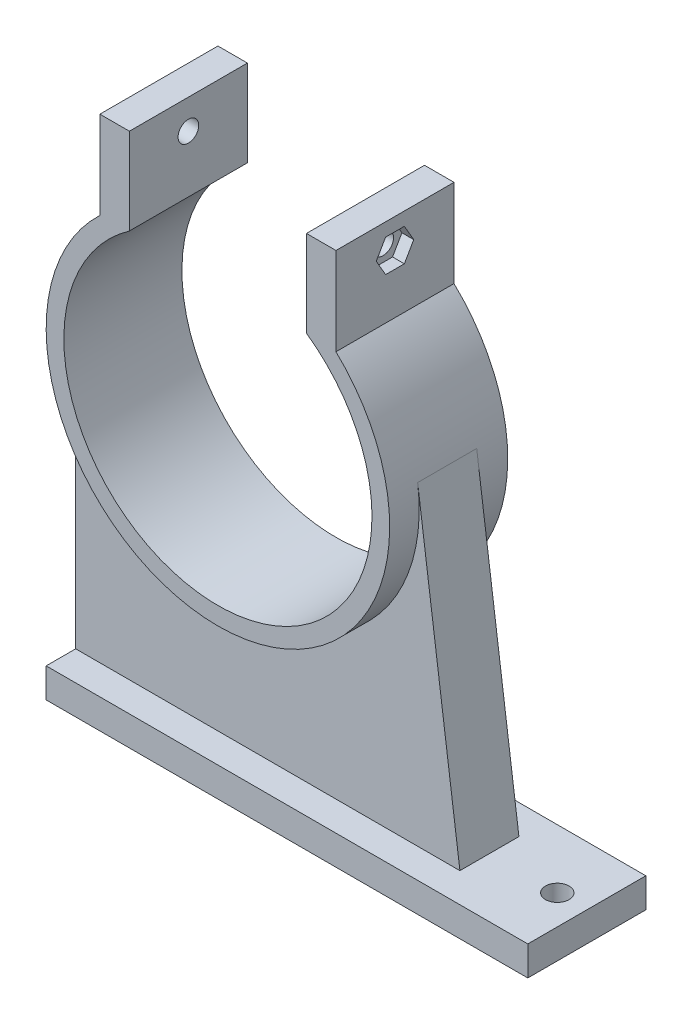
ISO-10303-21;
HEADER;
FILE_DESCRIPTION(('STEP AP214'),'2;1');
FILE_NAME('part.step','',(''),(''),'','','');
FILE_SCHEMA(('AUTOMOTIVE_DESIGN { 1 0 10303 214 1 1 1 1 }'));
ENDSEC;
DATA;
#1=APPLICATION_CONTEXT('core data for automotive mechanical design processes');
#2=APPLICATION_PROTOCOL_DEFINITION('international standard','automotive_design',2000,#1);
#3=PRODUCT_CONTEXT('',#1,'mechanical');
#4=PRODUCT('Part','Part','',(#3));
#5=PRODUCT_RELATED_PRODUCT_CATEGORY('part','',(#4));
#6=PRODUCT_DEFINITION_FORMATION('','',#4);
#7=PRODUCT_DEFINITION_CONTEXT('part definition',#1,'design');
#8=PRODUCT_DEFINITION('design','',#6,#7);
#9=PRODUCT_DEFINITION_SHAPE('','',#8);
#10=(LENGTH_UNIT() NAMED_UNIT(*) SI_UNIT(.MILLI.,.METRE.));
#11=(NAMED_UNIT(*) PLANE_ANGLE_UNIT() SI_UNIT($,.RADIAN.));
#12=(NAMED_UNIT(*) SI_UNIT($,.STERADIAN.) SOLID_ANGLE_UNIT());
#13=UNCERTAINTY_MEASURE_WITH_UNIT(LENGTH_MEASURE(1.E-05),#10,'distance_accuracy_value','');
#14=(GEOMETRIC_REPRESENTATION_CONTEXT(3) GLOBAL_UNCERTAINTY_ASSIGNED_CONTEXT((#13)) GLOBAL_UNIT_ASSIGNED_CONTEXT((#10,
#11,#12)) REPRESENTATION_CONTEXT('',''));
#15=CARTESIAN_POINT('',(0.,0.,0.));
#16=DIRECTION('',(0.,0.,1.));
#17=DIRECTION('',(1.,0.,0.));
#18=AXIS2_PLACEMENT_3D('',#15,#16,#17);
#19=CARTESIAN_POINT('',(0.,0.,20.));
#20=DIRECTION('',(0.,0.,-1.));
#21=DIRECTION('',(-1.,0.,0.));
#22=AXIS2_PLACEMENT_3D('',#19,#20,#21);
#23=CYLINDRICAL_SURFACE('',#22,29.1);
#24=CARTESIAN_POINT('',(0.,0.,0.));
#25=DIRECTION('',(0.,0.,1.));
#26=DIRECTION('',(1.,0.,0.));
#27=AXIS2_PLACEMENT_3D('',#24,#25,#26);
#28=CIRCLE('',#27,29.1);
#29=CARTESIAN_POINT('',(-20.,21.1378806884702,0.));
#30=VERTEX_POINT('',#29);
#31=CARTESIAN_POINT('',(20.,21.1378806884702,0.));
#32=VERTEX_POINT('',#31);
#33=EDGE_CURVE('E432',#30,#32,#28,.T.);
#34=ORIENTED_EDGE('',*,*,#33,.T.);
#35=DIRECTION('',(0.,0.,-1.));
#36=VECTOR('',#35,1.);
#37=CARTESIAN_POINT('',(20.,21.1378806884702,20.));
#38=LINE('',#37,#36);
#39=CARTESIAN_POINT('',(20.,21.1378806884702,20.));
#40=VERTEX_POINT('',#39);
#41=EDGE_CURVE('E50',#32,#40,#38,.F.);
#42=ORIENTED_EDGE('',*,*,#41,.T.);
#43=CARTESIAN_POINT('',(0.,0.,20.));
#44=DIRECTION('',(0.,0.,1.));
#45=DIRECTION('',(1.,0.,0.));
#46=AXIS2_PLACEMENT_3D('',#43,#44,#45);
#47=CIRCLE('',#46,29.1);
#48=CARTESIAN_POINT('',(-20.,21.1378806884702,20.));
#49=VERTEX_POINT('',#48);
#50=EDGE_CURVE('E435',#49,#40,#47,.T.);
#51=ORIENTED_EDGE('',*,*,#50,.F.);
#52=DIRECTION('',(0.,0.,-1.));
#53=VECTOR('',#52,1.);
#54=CARTESIAN_POINT('',(-20.,21.1378806884702,20.));
#55=LINE('',#54,#53);
#56=EDGE_CURVE('E439',#49,#30,#55,.T.);
#57=ORIENTED_EDGE('',*,*,#56,.T.);
#58=EDGE_LOOP('',(#34,#42,#51,#57));
#59=FACE_BOUND('',#58,.T.);
#60=CARTESIAN_POINT('',(0.,0.,15.));
#61=DIRECTION('',(0.,0.,-1.));
#62=DIRECTION('',(-1.,0.,0.));
#63=AXIS2_PLACEMENT_3D('',#60,#61,#62);
#64=CIRCLE('',#63,29.1);
#65=CARTESIAN_POINT('',(28.8417154559818,3.86852033162312,15.));
#66=VERTEX_POINT('',#65);
#67=CARTESIAN_POINT('',(-29.1,0.,15.));
#68=VERTEX_POINT('',#67);
#69=EDGE_CURVE('E282',#66,#68,#64,.T.);
#70=ORIENTED_EDGE('',*,*,#69,.F.);
#71=DIRECTION('',(0.,0.,-1.));
#72=VECTOR('',#71,1.);
#73=CARTESIAN_POINT('',(28.8417154559818,3.86852033162312,15.));
#74=LINE('',#73,#72);
#75=CARTESIAN_POINT('',(28.8417154559818,3.86852033162312,5.));
#76=VERTEX_POINT('',#75);
#77=EDGE_CURVE('E265',#66,#76,#74,.T.);
#78=ORIENTED_EDGE('',*,*,#77,.T.);
#79=CARTESIAN_POINT('',(0.,0.,5.));
#80=DIRECTION('',(0.,0.,-1.));
#81=DIRECTION('',(-1.,0.,0.));
#82=AXIS2_PLACEMENT_3D('',#79,#80,#81);
#83=CIRCLE('',#82,29.1);
#84=CARTESIAN_POINT('',(-29.1,0.,5.));
#85=VERTEX_POINT('',#84);
#86=EDGE_CURVE('E269',#76,#85,#83,.T.);
#87=ORIENTED_EDGE('',*,*,#86,.T.);
#88=DIRECTION('',(0.,0.,-1.));
#89=VECTOR('',#88,1.);
#90=CARTESIAN_POINT('',(-29.1,0.,15.));
#91=LINE('',#90,#89);
#92=EDGE_CURVE('E270',#68,#85,#91,.T.);
#93=ORIENTED_EDGE('',*,*,#92,.F.);
#94=EDGE_LOOP('',(#70,#78,#87,#93));
#95=FACE_BOUND('',#94,.T.);
#96=ADVANCED_FACE('F41',(#59,#95),#23,.T.);
#97=CARTESIAN_POINT('',(29.1,31.,10.));
#98=DIRECTION('',(-1.,0.,0.));
#99=DIRECTION('',(0.,0.,1.));
#100=AXIS2_PLACEMENT_3D('',#97,#98,#99);
#101=CYLINDRICAL_SURFACE('',#100,1.75);
#102=CARTESIAN_POINT('',(15.,31.,10.));
#103=DIRECTION('',(-1.,0.,0.));
#104=DIRECTION('',(0.,0.,1.));
#105=AXIS2_PLACEMENT_3D('',#102,#103,#104);
#106=CIRCLE('',#105,1.75);
#107=CARTESIAN_POINT('',(15.,31.,11.75));
#108=VERTEX_POINT('',#107);
#109=EDGE_CURVE('E366',#108,#108,#106,.T.);
#110=ORIENTED_EDGE('',*,*,#109,.T.);
#111=EDGE_LOOP('',(#110));
#112=FACE_BOUND('',#111,.T.);
#113=CARTESIAN_POINT('',(18.,31.,10.));
#114=DIRECTION('',(1.,0.,0.));
#115=DIRECTION('',(0.,0.,-1.));
#116=AXIS2_PLACEMENT_3D('',#113,#114,#115);
#117=CIRCLE('',#116,1.75);
#118=CARTESIAN_POINT('',(18.,31.,8.25));
#119=VERTEX_POINT('',#118);
#120=EDGE_CURVE('E44',#119,#119,#117,.F.);
#121=ORIENTED_EDGE('',*,*,#120,.F.);
#122=EDGE_LOOP('',(#121));
#123=FACE_BOUND('',#122,.T.);
#124=ADVANCED_FACE('F458',(#112,#123),#101,.F.);
#125=CARTESIAN_POINT('',(-15.,31.,10.));
#126=DIRECTION('',(1.,0.,0.));
#127=DIRECTION('',(0.,0.,-1.));
#128=AXIS2_PLACEMENT_3D('',#125,#126,#127);
#129=CIRCLE('',#128,1.75);
#130=CARTESIAN_POINT('',(-15.,31.,8.25));
#131=VERTEX_POINT('',#130);
#132=EDGE_CURVE('E361',#131,#131,#129,.T.);
#133=ORIENTED_EDGE('',*,*,#132,.T.);
#134=EDGE_LOOP('',(#133));
#135=FACE_BOUND('',#134,.T.);
#136=CARTESIAN_POINT('',(-18.,31.,10.));
#137=DIRECTION('',(-1.,0.,0.));
#138=DIRECTION('',(0.,0.,1.));
#139=AXIS2_PLACEMENT_3D('',#136,#137,#138);
#140=CIRCLE('',#139,1.75);
#141=CARTESIAN_POINT('',(-18.,31.,11.75));
#142=VERTEX_POINT('',#141);
#143=EDGE_CURVE('E356',#142,#142,#140,.F.);
#144=ORIENTED_EDGE('',*,*,#143,.F.);
#145=EDGE_LOOP('',(#144));
#146=FACE_BOUND('',#145,.T.);
#147=ADVANCED_FACE('F455',(#135,#146),#101,.F.);
#148=CARTESIAN_POINT('',(0.,0.,20.));
#149=DIRECTION('',(0.,0.,1.));
#150=DIRECTION('',(1.,0.,0.));
#151=AXIS2_PLACEMENT_3D('',#148,#149,#150);
#152=PLANE('',#151);
#153=DIRECTION('',(0.,-1.,0.));
#154=VECTOR('',#153,1.);
#155=CARTESIAN_POINT('',(15.,36.,20.));
#156=LINE('',#155,#154);
#157=CARTESIAN_POINT('',(15.,36.,20.));
#158=VERTEX_POINT('',#157);
#159=CARTESIAN_POINT('',(15.,21.3590730135931,20.));
#160=VERTEX_POINT('',#159);
#161=EDGE_CURVE('E370',#158,#160,#156,.T.);
#162=ORIENTED_EDGE('',*,*,#161,.T.);
#163=CARTESIAN_POINT('',(0.,0.,20.));
#164=DIRECTION('',(0.,0.,1.));
#165=DIRECTION('',(1.,0.,0.));
#166=AXIS2_PLACEMENT_3D('',#163,#164,#165);
#167=CIRCLE('',#166,26.1);
#168=CARTESIAN_POINT('',(-15.,21.3590730135931,20.));
#169=VERTEX_POINT('',#168);
#170=EDGE_CURVE('E429',#169,#160,#167,.T.);
#171=ORIENTED_EDGE('',*,*,#170,.F.);
#172=DIRECTION('',(0.,1.,0.));
#173=VECTOR('',#172,1.);
#174=CARTESIAN_POINT('',(-15.,36.,20.));
#175=LINE('',#174,#173);
#176=CARTESIAN_POINT('',(-15.,36.,20.));
#177=VERTEX_POINT('',#176);
#178=EDGE_CURVE('E382',#169,#177,#175,.T.);
#179=ORIENTED_EDGE('',*,*,#178,.T.);
#180=DIRECTION('',(-1.,0.,0.));
#181=VECTOR('',#180,1.);
#182=CARTESIAN_POINT('',(-15.,36.,20.));
#183=LINE('',#182,#181);
#184=CARTESIAN_POINT('',(-20.,36.,20.));
#185=VERTEX_POINT('',#184);
#186=EDGE_CURVE('E411',#177,#185,#183,.T.);
#187=ORIENTED_EDGE('',*,*,#186,.T.);
#188=DIRECTION('',(0.,-1.,0.));
#189=VECTOR('',#188,1.);
#190=CARTESIAN_POINT('',(-20.,36.,20.));
#191=LINE('',#190,#189);
#192=EDGE_CURVE('E415',#185,#49,#191,.T.);
#193=ORIENTED_EDGE('',*,*,#192,.T.);
#194=ORIENTED_EDGE('',*,*,#50,.T.);
#195=DIRECTION('',(0.,1.,0.));
#196=VECTOR('',#195,1.);
#197=CARTESIAN_POINT('',(20.,36.,20.));
#198=LINE('',#197,#196);
#199=CARTESIAN_POINT('',(20.,36.,20.));
#200=VERTEX_POINT('',#199);
#201=EDGE_CURVE('E386',#40,#200,#198,.T.);
#202=ORIENTED_EDGE('',*,*,#201,.T.);
#203=DIRECTION('',(-1.,0.,0.));
#204=VECTOR('',#203,1.);
#205=CARTESIAN_POINT('',(15.,36.,20.));
#206=LINE('',#205,#204);
#207=EDGE_CURVE('E389',#200,#158,#206,.T.);
#208=ORIENTED_EDGE('',*,*,#207,.T.);
#209=EDGE_LOOP('',(#162,#171,#179,#187,#193,#194,#202,#208));
#210=FACE_BOUND('',#209,.T.);
#211=ADVANCED_FACE('F457',(#210),#152,.T.);
#212=CARTESIAN_POINT('',(0.,0.,0.));
#213=DIRECTION('',(0.,0.,1.));
#214=DIRECTION('',(1.,0.,0.));
#215=AXIS2_PLACEMENT_3D('',#212,#213,#214);
#216=PLANE('',#215);
#217=CARTESIAN_POINT('',(0.,0.,0.));
#218=DIRECTION('',(0.,0.,1.));
#219=DIRECTION('',(1.,0.,0.));
#220=AXIS2_PLACEMENT_3D('',#217,#218,#219);
#221=CIRCLE('',#220,26.1);
#222=CARTESIAN_POINT('',(-15.,21.3590730135931,0.));
#223=VERTEX_POINT('',#222);
#224=CARTESIAN_POINT('',(15.,21.3590730135931,0.));
#225=VERTEX_POINT('',#224);
#226=EDGE_CURVE('E428',#223,#225,#221,.T.);
#227=ORIENTED_EDGE('',*,*,#226,.T.);
#228=DIRECTION('',(0.,1.,0.));
#229=VECTOR('',#228,1.);
#230=CARTESIAN_POINT('',(15.,36.,0.));
#231=LINE('',#230,#229);
#232=CARTESIAN_POINT('',(15.,36.,0.));
#233=VERTEX_POINT('',#232);
#234=EDGE_CURVE('E379',#225,#233,#231,.T.);
#235=ORIENTED_EDGE('',*,*,#234,.T.);
#236=DIRECTION('',(1.,0.,0.));
#237=VECTOR('',#236,1.);
#238=CARTESIAN_POINT('',(15.,36.,0.));
#239=LINE('',#238,#237);
#240=CARTESIAN_POINT('',(20.,36.,0.));
#241=VERTEX_POINT('',#240);
#242=EDGE_CURVE('E375',#233,#241,#239,.T.);
#243=ORIENTED_EDGE('',*,*,#242,.T.);
#244=DIRECTION('',(0.,-1.,0.));
#245=VECTOR('',#244,1.);
#246=CARTESIAN_POINT('',(20.,36.,0.));
#247=LINE('',#246,#245);
#248=EDGE_CURVE('E371',#241,#32,#247,.T.);
#249=ORIENTED_EDGE('',*,*,#248,.T.);
#250=ORIENTED_EDGE('',*,*,#33,.F.);
#251=DIRECTION('',(0.,1.,0.));
#252=VECTOR('',#251,1.);
#253=CARTESIAN_POINT('',(-20.,36.,0.));
#254=LINE('',#253,#252);
#255=CARTESIAN_POINT('',(-20.,36.,0.));
#256=VERTEX_POINT('',#255);
#257=EDGE_CURVE('E400',#30,#256,#254,.T.);
#258=ORIENTED_EDGE('',*,*,#257,.T.);
#259=DIRECTION('',(1.,0.,0.));
#260=VECTOR('',#259,1.);
#261=CARTESIAN_POINT('',(-15.,36.,0.));
#262=LINE('',#261,#260);
#263=CARTESIAN_POINT('',(-15.,36.,0.));
#264=VERTEX_POINT('',#263);
#265=EDGE_CURVE('E408',#256,#264,#262,.T.);
#266=ORIENTED_EDGE('',*,*,#265,.T.);
#267=DIRECTION('',(0.,-1.,0.));
#268=VECTOR('',#267,1.);
#269=CARTESIAN_POINT('',(-15.,36.,0.));
#270=LINE('',#269,#268);
#271=EDGE_CURVE('E403',#264,#223,#270,.T.);
#272=ORIENTED_EDGE('',*,*,#271,.T.);
#273=EDGE_LOOP('',(#227,#235,#243,#249,#250,#258,#266,#272));
#274=FACE_BOUND('',#273,.T.);
#275=ADVANCED_FACE('F465',(#274),#216,.F.);
#276=CARTESIAN_POINT('',(0.,0.,20.));
#277=DIRECTION('',(0.,0.,-1.));
#278=DIRECTION('',(-1.,0.,0.));
#279=AXIS2_PLACEMENT_3D('',#276,#277,#278);
#280=CYLINDRICAL_SURFACE('',#279,26.1);
#281=ORIENTED_EDGE('',*,*,#170,.T.);
#282=DIRECTION('',(0.,0.,1.));
#283=VECTOR('',#282,1.);
#284=CARTESIAN_POINT('',(15.,21.3590730135931,0.));
#285=LINE('',#284,#283);
#286=EDGE_CURVE('E11',#160,#225,#285,.F.);
#287=ORIENTED_EDGE('',*,*,#286,.T.);
#288=ORIENTED_EDGE('',*,*,#226,.F.);
#289=DIRECTION('',(0.,0.,1.));
#290=VECTOR('',#289,1.);
#291=CARTESIAN_POINT('',(-15.,21.3590730135931,0.));
#292=LINE('',#291,#290);
#293=EDGE_CURVE('E365',#223,#169,#292,.T.);
#294=ORIENTED_EDGE('',*,*,#293,.T.);
#295=EDGE_LOOP('',(#281,#287,#288,#294));
#296=FACE_BOUND('',#295,.T.);
#297=ADVANCED_FACE('F552',(#296),#280,.F.);
#298=CARTESIAN_POINT('',(-20.,36.,-17.9122929423735));
#299=DIRECTION('',(-1.,0.,0.));
#300=DIRECTION('',(0.,0.,1.));
#301=AXIS2_PLACEMENT_3D('',#298,#299,#300);
#302=PLANE('',#301);
#303=CARTESIAN_POINT('',(-20.,31.,10.));
#304=DIRECTION('',(-1.,0.,0.));
#305=DIRECTION('',(0.,0.,1.));
#306=AXIS2_PLACEMENT_3D('',#303,#304,#305);
#307=CIRCLE('',#306,3.25);
#308=CARTESIAN_POINT('',(-20.,31.,13.25));
#309=VERTEX_POINT('',#308);
#310=EDGE_CURVE('E357',#309,#309,#307,.T.);
#311=ORIENTED_EDGE('',*,*,#310,.F.);
#312=EDGE_LOOP('',(#311));
#313=FACE_BOUND('',#312,.T.);
#314=ORIENTED_EDGE('',*,*,#56,.F.);
#315=ORIENTED_EDGE('',*,*,#192,.F.);
#316=DIRECTION('',(0.,0.,1.));
#317=VECTOR('',#316,1.);
#318=CARTESIAN_POINT('',(-20.,36.,-17.9122929423735));
#319=LINE('',#318,#317);
#320=EDGE_CURVE('E404',#256,#185,#319,.T.);
#321=ORIENTED_EDGE('',*,*,#320,.F.);
#322=ORIENTED_EDGE('',*,*,#257,.F.);
#323=EDGE_LOOP('',(#314,#315,#321,#322));
#324=FACE_BOUND('',#323,.T.);
#325=ADVANCED_FACE('F548',(#313,#324),#302,.T.);
#326=CARTESIAN_POINT('',(-15.,36.,-17.9122929423735));
#327=DIRECTION('',(1.,0.,0.));
#328=DIRECTION('',(0.,0.,-1.));
#329=AXIS2_PLACEMENT_3D('',#326,#327,#328);
#330=PLANE('',#329);
#331=ORIENTED_EDGE('',*,*,#132,.F.);
#332=EDGE_LOOP('',(#331));
#333=FACE_BOUND('',#332,.T.);
#334=ORIENTED_EDGE('',*,*,#293,.F.);
#335=ORIENTED_EDGE('',*,*,#271,.F.);
#336=DIRECTION('',(0.,0.,1.));
#337=VECTOR('',#336,1.);
#338=CARTESIAN_POINT('',(-15.,36.,-17.9122929423735));
#339=LINE('',#338,#337);
#340=EDGE_CURVE('E419',#264,#177,#339,.T.);
#341=ORIENTED_EDGE('',*,*,#340,.T.);
#342=ORIENTED_EDGE('',*,*,#178,.F.);
#343=EDGE_LOOP('',(#334,#335,#341,#342));
#344=FACE_BOUND('',#343,.T.);
#345=ADVANCED_FACE('F551',(#333,#344),#330,.T.);
#346=CARTESIAN_POINT('',(-15.,36.,-17.9122929423735));
#347=DIRECTION('',(0.,1.,0.));
#348=DIRECTION('',(0.,0.,1.));
#349=AXIS2_PLACEMENT_3D('',#346,#347,#348);
#350=PLANE('',#349);
#351=ORIENTED_EDGE('',*,*,#265,.F.);
#352=ORIENTED_EDGE('',*,*,#320,.T.);
#353=ORIENTED_EDGE('',*,*,#186,.F.);
#354=ORIENTED_EDGE('',*,*,#340,.F.);
#355=EDGE_LOOP('',(#351,#352,#353,#354));
#356=FACE_BOUND('',#355,.T.);
#357=ADVANCED_FACE('F564',(#356),#350,.T.);
#358=CARTESIAN_POINT('',(20.,36.,-17.9122929423735));
#359=DIRECTION('',(1.,0.,0.));
#360=DIRECTION('',(0.,0.,-1.));
#361=AXIS2_PLACEMENT_3D('',#358,#359,#360);
#362=PLANE('',#361);
#363=DIRECTION('',(0.,0.,-1.));
#364=VECTOR('',#363,1.);
#365=CARTESIAN_POINT('',(20.,28.25,11.5877132402715));
#366=LINE('',#365,#364);
#367=CARTESIAN_POINT('',(20.,28.25,11.5877132402715));
#368=VERTEX_POINT('',#367);
#369=CARTESIAN_POINT('',(20.,28.25,8.41228675972853));
#370=VERTEX_POINT('',#369);
#371=EDGE_CURVE('E286',#368,#370,#366,.T.);
#372=ORIENTED_EDGE('',*,*,#371,.F.);
#373=DIRECTION('',(0.,-0.866025403784439,-0.5));
#374=VECTOR('',#373,1.);
#375=CARTESIAN_POINT('',(20.,31.,13.1754264805429));
#376=LINE('',#375,#374);
#377=CARTESIAN_POINT('',(20.,31.,13.1754264805429));
#378=VERTEX_POINT('',#377);
#379=EDGE_CURVE('E292',#378,#368,#376,.T.);
#380=ORIENTED_EDGE('',*,*,#379,.F.);
#381=DIRECTION('',(0.,-0.866025403784439,0.5));
#382=VECTOR('',#381,1.);
#383=CARTESIAN_POINT('',(20.,33.75,11.5877132402715));
#384=LINE('',#383,#382);
#385=CARTESIAN_POINT('',(20.,33.75,11.5877132402715));
#386=VERTEX_POINT('',#385);
#387=EDGE_CURVE('E327',#386,#378,#384,.T.);
#388=ORIENTED_EDGE('',*,*,#387,.F.);
#389=DIRECTION('',(0.,0.,1.));
#390=VECTOR('',#389,1.);
#391=CARTESIAN_POINT('',(20.,33.75,8.41228675972853));
#392=LINE('',#391,#390);
#393=CARTESIAN_POINT('',(20.,33.75,8.41228675972853));
#394=VERTEX_POINT('',#393);
#395=EDGE_CURVE('E323',#394,#386,#392,.T.);
#396=ORIENTED_EDGE('',*,*,#395,.F.);
#397=DIRECTION('',(0.,0.866025403784439,0.5));
#398=VECTOR('',#397,1.);
#399=CARTESIAN_POINT('',(20.,31.,6.82457351945706));
#400=LINE('',#399,#398);
#401=CARTESIAN_POINT('',(20.,31.,6.82457351945706));
#402=VERTEX_POINT('',#401);
#403=EDGE_CURVE('E319',#402,#394,#400,.T.);
#404=ORIENTED_EDGE('',*,*,#403,.F.);
#405=DIRECTION('',(0.,0.866025403784439,-0.5));
#406=VECTOR('',#405,1.);
#407=CARTESIAN_POINT('',(20.,28.25,8.41228675972853));
#408=LINE('',#407,#406);
#409=EDGE_CURVE('E315',#370,#402,#408,.T.);
#410=ORIENTED_EDGE('',*,*,#409,.F.);
#411=EDGE_LOOP('',(#372,#380,#388,#396,#404,#410));
#412=FACE_BOUND('',#411,.T.);
#413=ORIENTED_EDGE('',*,*,#41,.F.);
#414=ORIENTED_EDGE('',*,*,#248,.F.);
#415=DIRECTION('',(0.,0.,1.));
#416=VECTOR('',#415,1.);
#417=CARTESIAN_POINT('',(20.,36.,-17.9122929423735));
#418=LINE('',#417,#416);
#419=EDGE_CURVE('E393',#241,#200,#418,.T.);
#420=ORIENTED_EDGE('',*,*,#419,.T.);
#421=ORIENTED_EDGE('',*,*,#201,.F.);
#422=EDGE_LOOP('',(#413,#414,#420,#421));
#423=FACE_BOUND('',#422,.T.);
#424=ADVANCED_FACE('F570',(#412,#423),#362,.T.);
#425=CARTESIAN_POINT('',(15.,36.,-17.9122929423735));
#426=DIRECTION('',(-1.,0.,0.));
#427=DIRECTION('',(0.,0.,1.));
#428=AXIS2_PLACEMENT_3D('',#425,#426,#427);
#429=PLANE('',#428);
#430=ORIENTED_EDGE('',*,*,#109,.F.);
#431=EDGE_LOOP('',(#430));
#432=FACE_BOUND('',#431,.T.);
#433=ORIENTED_EDGE('',*,*,#286,.F.);
#434=ORIENTED_EDGE('',*,*,#161,.F.);
#435=DIRECTION('',(0.,0.,1.));
#436=VECTOR('',#435,1.);
#437=CARTESIAN_POINT('',(15.,36.,-17.9122929423735));
#438=LINE('',#437,#436);
#439=EDGE_CURVE('E376',#233,#158,#438,.T.);
#440=ORIENTED_EDGE('',*,*,#439,.F.);
#441=ORIENTED_EDGE('',*,*,#234,.F.);
#442=EDGE_LOOP('',(#433,#434,#440,#441));
#443=FACE_BOUND('',#442,.T.);
#444=ADVANCED_FACE('F542',(#432,#443),#429,.T.);
#445=CARTESIAN_POINT('',(15.,36.,-17.9122929423735));
#446=DIRECTION('',(0.,1.,0.));
#447=DIRECTION('',(0.,0.,1.));
#448=AXIS2_PLACEMENT_3D('',#445,#446,#447);
#449=PLANE('',#448);
#450=ORIENTED_EDGE('',*,*,#242,.F.);
#451=ORIENTED_EDGE('',*,*,#439,.T.);
#452=ORIENTED_EDGE('',*,*,#207,.F.);
#453=ORIENTED_EDGE('',*,*,#419,.F.);
#454=EDGE_LOOP('',(#450,#451,#452,#453));
#455=FACE_BOUND('',#454,.T.);
#456=ADVANCED_FACE('F537',(#455),#449,.T.);
#457=CARTESIAN_POINT('',(-18.,31.,10.));
#458=DIRECTION('',(-1.,0.,0.));
#459=DIRECTION('',(0.,0.,1.));
#460=AXIS2_PLACEMENT_3D('',#457,#458,#459);
#461=PLANE('',#460);
#462=CARTESIAN_POINT('',(-18.,31.,10.));
#463=DIRECTION('',(-1.,0.,0.));
#464=DIRECTION('',(0.,0.,1.));
#465=AXIS2_PLACEMENT_3D('',#462,#463,#464);
#466=CIRCLE('',#465,3.25);
#467=CARTESIAN_POINT('',(-18.,31.,13.25));
#468=VERTEX_POINT('',#467);
#469=EDGE_CURVE('E352',#468,#468,#466,.T.);
#470=ORIENTED_EDGE('',*,*,#469,.T.);
#471=EDGE_LOOP('',(#470));
#472=FACE_BOUND('',#471,.T.);
#473=ORIENTED_EDGE('',*,*,#143,.T.);
#474=EDGE_LOOP('',(#473));
#475=FACE_BOUND('',#474,.T.);
#476=ADVANCED_FACE('F453',(#472,#475),#461,.T.);
#477=CARTESIAN_POINT('',(-18.,31.,10.));
#478=DIRECTION('',(-1.,0.,0.));
#479=DIRECTION('',(0.,0.,1.));
#480=AXIS2_PLACEMENT_3D('',#477,#478,#479);
#481=CYLINDRICAL_SURFACE('',#480,3.25);
#482=ORIENTED_EDGE('',*,*,#469,.F.);
#483=EDGE_LOOP('',(#482));
#484=FACE_BOUND('',#483,.T.);
#485=ORIENTED_EDGE('',*,*,#310,.T.);
#486=EDGE_LOOP('',(#485));
#487=FACE_BOUND('',#486,.T.);
#488=ADVANCED_FACE('F503',(#484,#487),#481,.F.);
#489=CARTESIAN_POINT('',(18.,0.,0.));
#490=DIRECTION('',(1.,0.,0.));
#491=DIRECTION('',(0.,0.,-1.));
#492=AXIS2_PLACEMENT_3D('',#489,#490,#491);
#493=PLANE('',#492);
#494=DIRECTION('',(0.,0.,-1.));
#495=VECTOR('',#494,1.);
#496=CARTESIAN_POINT('',(18.,28.25,11.5877132402715));
#497=LINE('',#496,#495);
#498=CARTESIAN_POINT('',(18.,28.25,11.5877132402715));
#499=VERTEX_POINT('',#498);
#500=CARTESIAN_POINT('',(18.,28.25,8.41228675972853));
#501=VERTEX_POINT('',#500);
#502=EDGE_CURVE('E287',#499,#501,#497,.T.);
#503=ORIENTED_EDGE('',*,*,#502,.T.);
#504=DIRECTION('',(0.,0.866025403784439,-0.5));
#505=VECTOR('',#504,1.);
#506=CARTESIAN_POINT('',(18.,28.25,8.41228675972853));
#507=LINE('',#506,#505);
#508=CARTESIAN_POINT('',(18.,31.,6.82457351945706));
#509=VERTEX_POINT('',#508);
#510=EDGE_CURVE('E291',#501,#509,#507,.T.);
#511=ORIENTED_EDGE('',*,*,#510,.T.);
#512=DIRECTION('',(0.,0.866025403784439,0.5));
#513=VECTOR('',#512,1.);
#514=CARTESIAN_POINT('',(18.,31.,6.82457351945706));
#515=LINE('',#514,#513);
#516=CARTESIAN_POINT('',(18.,33.75,8.41228675972853));
#517=VERTEX_POINT('',#516);
#518=EDGE_CURVE('E296',#509,#517,#515,.T.);
#519=ORIENTED_EDGE('',*,*,#518,.T.);
#520=DIRECTION('',(0.,0.,1.));
#521=VECTOR('',#520,1.);
#522=CARTESIAN_POINT('',(18.,33.75,8.41228675972853));
#523=LINE('',#522,#521);
#524=CARTESIAN_POINT('',(18.,33.75,11.5877132402715));
#525=VERTEX_POINT('',#524);
#526=EDGE_CURVE('E300',#517,#525,#523,.T.);
#527=ORIENTED_EDGE('',*,*,#526,.T.);
#528=DIRECTION('',(0.,-0.866025403784439,0.5));
#529=VECTOR('',#528,1.);
#530=CARTESIAN_POINT('',(18.,33.75,11.5877132402715));
#531=LINE('',#530,#529);
#532=CARTESIAN_POINT('',(18.,31.,13.1754264805429));
#533=VERTEX_POINT('',#532);
#534=EDGE_CURVE('E304',#525,#533,#531,.T.);
#535=ORIENTED_EDGE('',*,*,#534,.T.);
#536=DIRECTION('',(0.,-0.866025403784439,-0.5));
#537=VECTOR('',#536,1.);
#538=CARTESIAN_POINT('',(18.,31.,13.1754264805429));
#539=LINE('',#538,#537);
#540=EDGE_CURVE('E308',#533,#499,#539,.T.);
#541=ORIENTED_EDGE('',*,*,#540,.T.);
#542=EDGE_LOOP('',(#503,#511,#519,#527,#535,#541));
#543=FACE_BOUND('',#542,.T.);
#544=ORIENTED_EDGE('',*,*,#120,.T.);
#545=EDGE_LOOP('',(#544));
#546=FACE_BOUND('',#545,.T.);
#547=ADVANCED_FACE('F499',(#543,#546),#493,.T.);
#548=CARTESIAN_POINT('',(18.,28.25,11.5877132402715));
#549=DIRECTION('',(0.,-1.,0.));
#550=DIRECTION('',(0.,0.,-1.));
#551=AXIS2_PLACEMENT_3D('',#548,#549,#550);
#552=PLANE('',#551);
#553=ORIENTED_EDGE('',*,*,#371,.T.);
#554=DIRECTION('',(1.,0.,0.));
#555=VECTOR('',#554,1.);
#556=CARTESIAN_POINT('',(18.,28.25,8.41228675972853));
#557=LINE('',#556,#555);
#558=EDGE_CURVE('E312',#501,#370,#557,.T.);
#559=ORIENTED_EDGE('',*,*,#558,.F.);
#560=ORIENTED_EDGE('',*,*,#502,.F.);
#561=DIRECTION('',(1.,0.,0.));
#562=VECTOR('',#561,1.);
#563=CARTESIAN_POINT('',(18.,28.25,11.5877132402715));
#564=LINE('',#563,#562);
#565=EDGE_CURVE('E334',#499,#368,#564,.T.);
#566=ORIENTED_EDGE('',*,*,#565,.T.);
#567=EDGE_LOOP('',(#553,#559,#560,#566));
#568=FACE_BOUND('',#567,.T.);
#569=ADVANCED_FACE('F502',(#568),#552,.F.);
#570=CARTESIAN_POINT('',(18.,31.,13.1754264805429));
#571=DIRECTION('',(0.,-0.5,0.866025403784439));
#572=DIRECTION('',(0.,-0.866025403784439,-0.5));
#573=AXIS2_PLACEMENT_3D('',#570,#571,#572);
#574=PLANE('',#573);
#575=ORIENTED_EDGE('',*,*,#379,.T.);
#576=ORIENTED_EDGE('',*,*,#565,.F.);
#577=ORIENTED_EDGE('',*,*,#540,.F.);
#578=DIRECTION('',(1.,0.,0.));
#579=VECTOR('',#578,1.);
#580=CARTESIAN_POINT('',(18.,31.,13.1754264805429));
#581=LINE('',#580,#579);
#582=EDGE_CURVE('E337',#533,#378,#581,.T.);
#583=ORIENTED_EDGE('',*,*,#582,.T.);
#584=EDGE_LOOP('',(#575,#576,#577,#583));
#585=FACE_BOUND('',#584,.T.);
#586=ADVANCED_FACE('F510',(#585),#574,.F.);
#587=CARTESIAN_POINT('',(18.,33.75,11.5877132402715));
#588=DIRECTION('',(0.,0.5,0.866025403784439));
#589=DIRECTION('',(0.,-0.866025403784439,0.5));
#590=AXIS2_PLACEMENT_3D('',#587,#588,#589);
#591=PLANE('',#590);
#592=ORIENTED_EDGE('',*,*,#387,.T.);
#593=ORIENTED_EDGE('',*,*,#582,.F.);
#594=ORIENTED_EDGE('',*,*,#534,.F.);
#595=DIRECTION('',(1.,0.,0.));
#596=VECTOR('',#595,1.);
#597=CARTESIAN_POINT('',(18.,33.75,11.5877132402715));
#598=LINE('',#597,#596);
#599=EDGE_CURVE('E340',#525,#386,#598,.T.);
#600=ORIENTED_EDGE('',*,*,#599,.T.);
#601=EDGE_LOOP('',(#592,#593,#594,#600));
#602=FACE_BOUND('',#601,.T.);
#603=ADVANCED_FACE('F519',(#602),#591,.F.);
#604=CARTESIAN_POINT('',(18.,33.75,8.41228675972853));
#605=DIRECTION('',(0.,1.,0.));
#606=DIRECTION('',(0.,0.,1.));
#607=AXIS2_PLACEMENT_3D('',#604,#605,#606);
#608=PLANE('',#607);
#609=ORIENTED_EDGE('',*,*,#395,.T.);
#610=ORIENTED_EDGE('',*,*,#599,.F.);
#611=ORIENTED_EDGE('',*,*,#526,.F.);
#612=DIRECTION('',(1.,0.,0.));
#613=VECTOR('',#612,1.);
#614=CARTESIAN_POINT('',(18.,33.75,8.41228675972853));
#615=LINE('',#614,#613);
#616=EDGE_CURVE('E343',#517,#394,#615,.T.);
#617=ORIENTED_EDGE('',*,*,#616,.T.);
#618=EDGE_LOOP('',(#609,#610,#611,#617));
#619=FACE_BOUND('',#618,.T.);
#620=ADVANCED_FACE('F523',(#619),#608,.F.);
#621=CARTESIAN_POINT('',(18.,31.,6.82457351945706));
#622=DIRECTION('',(0.,0.5,-0.866025403784439));
#623=DIRECTION('',(0.,0.866025403784439,0.5));
#624=AXIS2_PLACEMENT_3D('',#621,#622,#623);
#625=PLANE('',#624);
#626=ORIENTED_EDGE('',*,*,#403,.T.);
#627=ORIENTED_EDGE('',*,*,#616,.F.);
#628=ORIENTED_EDGE('',*,*,#518,.F.);
#629=DIRECTION('',(1.,0.,0.));
#630=VECTOR('',#629,1.);
#631=CARTESIAN_POINT('',(18.,31.,6.82457351945706));
#632=LINE('',#631,#630);
#633=EDGE_CURVE('E346',#509,#402,#632,.T.);
#634=ORIENTED_EDGE('',*,*,#633,.T.);
#635=EDGE_LOOP('',(#626,#627,#628,#634));
#636=FACE_BOUND('',#635,.T.);
#637=ADVANCED_FACE('F527',(#636),#625,.F.);
#638=CARTESIAN_POINT('',(18.,28.25,8.41228675972853));
#639=DIRECTION('',(0.,-0.5,-0.866025403784439));
#640=DIRECTION('',(0.,0.866025403784439,-0.5));
#641=AXIS2_PLACEMENT_3D('',#638,#639,#640);
#642=PLANE('',#641);
#643=ORIENTED_EDGE('',*,*,#409,.T.);
#644=ORIENTED_EDGE('',*,*,#633,.F.);
#645=ORIENTED_EDGE('',*,*,#510,.F.);
#646=ORIENTED_EDGE('',*,*,#558,.T.);
#647=EDGE_LOOP('',(#643,#644,#645,#646));
#648=FACE_BOUND('',#647,.T.);
#649=ADVANCED_FACE('F531',(#648),#642,.F.);
#650=CARTESIAN_POINT('',(0.,0.,15.));
#651=DIRECTION('',(0.,0.,-1.));
#652=DIRECTION('',(-1.,0.,0.));
#653=AXIS2_PLACEMENT_3D('',#650,#651,#652);
#654=PLANE('',#653);
#655=DIRECTION('',(0.,1.,0.));
#656=VECTOR('',#655,1.);
#657=CARTESIAN_POINT('',(-29.1,0.,15.));
#658=LINE('',#657,#656);
#659=CARTESIAN_POINT('',(-29.1,-49.5,15.));
#660=VERTEX_POINT('',#659);
#661=EDGE_CURVE('E256',#660,#68,#658,.T.);
#662=ORIENTED_EDGE('',*,*,#661,.F.);
#663=DIRECTION('',(1.,0.,0.));
#664=VECTOR('',#663,1.);
#665=CARTESIAN_POINT('',(0.,-49.5,15.));
#666=LINE('',#665,#664);
#667=CARTESIAN_POINT('',(36.,-49.5,15.));
#668=VERTEX_POINT('',#667);
#669=EDGE_CURVE('E249',#660,#668,#666,.T.);
#670=ORIENTED_EDGE('',*,*,#669,.T.);
#671=DIRECTION('',(-0.132938843011104,0.991124242473601,0.));
#672=VECTOR('',#671,1.);
#673=CARTESIAN_POINT('',(28.8417154559818,3.86852033162312,15.));
#674=LINE('',#673,#672);
#675=EDGE_CURVE('E253',#668,#66,#674,.T.);
#676=ORIENTED_EDGE('',*,*,#675,.T.);
#677=ORIENTED_EDGE('',*,*,#69,.T.);
#678=EDGE_LOOP('',(#662,#670,#676,#677));
#679=FACE_BOUND('',#678,.T.);
#680=ADVANCED_FACE('F482',(#679),#654,.F.);
#681=CARTESIAN_POINT('',(0.,0.,5.));
#682=DIRECTION('',(0.,0.,-1.));
#683=DIRECTION('',(-1.,0.,0.));
#684=AXIS2_PLACEMENT_3D('',#681,#682,#683);
#685=PLANE('',#684);
#686=DIRECTION('',(1.,0.,0.));
#687=VECTOR('',#686,1.);
#688=CARTESIAN_POINT('',(0.,-49.5,5.));
#689=LINE('',#688,#687);
#690=CARTESIAN_POINT('',(-29.1,-49.5,5.));
#691=VERTEX_POINT('',#690);
#692=CARTESIAN_POINT('',(36.,-49.5,5.));
#693=VERTEX_POINT('',#692);
#694=EDGE_CURVE('E58',#691,#693,#689,.T.);
#695=ORIENTED_EDGE('',*,*,#694,.F.);
#696=DIRECTION('',(0.,1.,0.));
#697=VECTOR('',#696,1.);
#698=CARTESIAN_POINT('',(-29.1,0.,5.));
#699=LINE('',#698,#697);
#700=EDGE_CURVE('E62',#691,#85,#699,.T.);
#701=ORIENTED_EDGE('',*,*,#700,.T.);
#702=ORIENTED_EDGE('',*,*,#86,.F.);
#703=DIRECTION('',(-0.132938843011104,0.991124242473601,0.));
#704=VECTOR('',#703,1.);
#705=CARTESIAN_POINT('',(28.8417154559818,3.86852033162312,5.));
#706=LINE('',#705,#704);
#707=EDGE_CURVE('E252',#693,#76,#706,.T.);
#708=ORIENTED_EDGE('',*,*,#707,.F.);
#709=EDGE_LOOP('',(#695,#701,#702,#708));
#710=FACE_BOUND('',#709,.T.);
#711=ADVANCED_FACE('F487',(#710),#685,.T.);
#712=CARTESIAN_POINT('',(28.8417154559818,3.86852033162312,15.));
#713=DIRECTION('',(-0.991124242473601,-0.132938843011104,0.));
#714=DIRECTION('',(0.132938843011104,-0.991124242473601,0.));
#715=AXIS2_PLACEMENT_3D('',#712,#713,#714);
#716=PLANE('',#715);
#717=ORIENTED_EDGE('',*,*,#707,.T.);
#718=ORIENTED_EDGE('',*,*,#77,.F.);
#719=ORIENTED_EDGE('',*,*,#675,.F.);
#720=DIRECTION('',(0.,0.,-1.));
#721=VECTOR('',#720,1.);
#722=CARTESIAN_POINT('',(36.,-49.5,15.));
#723=LINE('',#722,#721);
#724=EDGE_CURVE('E259',#668,#693,#723,.T.);
#725=ORIENTED_EDGE('',*,*,#724,.T.);
#726=EDGE_LOOP('',(#717,#718,#719,#725));
#727=FACE_BOUND('',#726,.T.);
#728=ADVANCED_FACE('F486',(#727),#716,.F.);
#729=CARTESIAN_POINT('',(-29.1,0.,15.));
#730=DIRECTION('',(-1.,0.,0.));
#731=DIRECTION('',(0.,-1.,0.));
#732=AXIS2_PLACEMENT_3D('',#729,#730,#731);
#733=PLANE('',#732);
#734=ORIENTED_EDGE('',*,*,#700,.F.);
#735=DIRECTION('',(0.,0.,-1.));
#736=VECTOR('',#735,1.);
#737=CARTESIAN_POINT('',(-29.1,-49.5,20.));
#738=LINE('',#737,#736);
#739=CARTESIAN_POINT('',(-29.1,-49.5,0.));
#740=VERTEX_POINT('',#739);
#741=EDGE_CURVE('E233',#691,#740,#738,.T.);
#742=ORIENTED_EDGE('',*,*,#741,.T.);
#743=DIRECTION('',(0.,1.,0.));
#744=VECTOR('',#743,1.);
#745=CARTESIAN_POINT('',(-29.1,-49.5,0.));
#746=LINE('',#745,#744);
#747=CARTESIAN_POINT('',(-29.1,-54.5,0.));
#748=VERTEX_POINT('',#747);
#749=EDGE_CURVE('E222',#748,#740,#746,.T.);
#750=ORIENTED_EDGE('',*,*,#749,.F.);
#751=DIRECTION('',(0.,0.,-1.));
#752=VECTOR('',#751,1.);
#753=CARTESIAN_POINT('',(-29.1,-54.5,15.));
#754=LINE('',#753,#752);
#755=CARTESIAN_POINT('',(-29.1,-54.5,20.));
#756=VERTEX_POINT('',#755);
#757=EDGE_CURVE('E202',#756,#748,#754,.T.);
#758=ORIENTED_EDGE('',*,*,#757,.F.);
#759=DIRECTION('',(0.,1.,0.));
#760=VECTOR('',#759,1.);
#761=CARTESIAN_POINT('',(-29.1,-49.5,20.));
#762=LINE('',#761,#760);
#763=CARTESIAN_POINT('',(-29.1,-49.5,20.));
#764=VERTEX_POINT('',#763);
#765=EDGE_CURVE('E213',#756,#764,#762,.T.);
#766=ORIENTED_EDGE('',*,*,#765,.T.);
#767=EDGE_CURVE('E243',#764,#660,#738,.T.);
#768=ORIENTED_EDGE('',*,*,#767,.T.);
#769=ORIENTED_EDGE('',*,*,#661,.T.);
#770=ORIENTED_EDGE('',*,*,#92,.T.);
#771=EDGE_LOOP('',(#734,#742,#750,#758,#766,#768,#769,#770));
#772=FACE_BOUND('',#771,.T.);
#773=ADVANCED_FACE('F708',(#772),#733,.T.);
#774=CARTESIAN_POINT('',(0.,-54.5,15.));
#775=DIRECTION('',(0.,-1.,0.));
#776=DIRECTION('',(0.,0.,-1.));
#777=AXIS2_PLACEMENT_3D('',#774,#775,#776);
#778=PLANE('',#777);
#779=CARTESIAN_POINT('',(47.5,-54.5,10.));
#780=DIRECTION('',(0.,1.,0.));
#781=DIRECTION('',(0.,0.,1.));
#782=AXIS2_PLACEMENT_3D('',#779,#780,#781);
#783=CIRCLE('',#782,2.);
#784=CARTESIAN_POINT('',(47.5,-54.5,12.));
#785=VERTEX_POINT('',#784);
#786=EDGE_CURVE('E237',#785,#785,#783,.T.);
#787=ORIENTED_EDGE('',*,*,#786,.T.);
#788=EDGE_LOOP('',(#787));
#789=FACE_BOUND('',#788,.T.);
#790=ORIENTED_EDGE('',*,*,#757,.T.);
#791=DIRECTION('',(-1.,0.,0.));
#792=VECTOR('',#791,1.);
#793=CARTESIAN_POINT('',(52.5,-54.5,0.));
#794=LINE('',#793,#792);
#795=CARTESIAN_POINT('',(52.5,-54.5,0.));
#796=VERTEX_POINT('',#795);
#797=EDGE_CURVE('E196',#796,#748,#794,.T.);
#798=ORIENTED_EDGE('',*,*,#797,.F.);
#799=DIRECTION('',(0.,0.,-1.));
#800=VECTOR('',#799,1.);
#801=CARTESIAN_POINT('',(52.5,-54.5,15.));
#802=LINE('',#801,#800);
#803=CARTESIAN_POINT('',(52.5,-54.5,20.));
#804=VERTEX_POINT('',#803);
#805=EDGE_CURVE('E191',#804,#796,#802,.T.);
#806=ORIENTED_EDGE('',*,*,#805,.F.);
#807=DIRECTION('',(-1.,0.,0.));
#808=VECTOR('',#807,1.);
#809=CARTESIAN_POINT('',(52.5,-54.5,20.));
#810=LINE('',#809,#808);
#811=EDGE_CURVE('E194',#804,#756,#810,.T.);
#812=ORIENTED_EDGE('',*,*,#811,.T.);
#813=EDGE_LOOP('',(#790,#798,#806,#812));
#814=FACE_BOUND('',#813,.T.);
#815=ADVANCED_FACE('F193',(#789,#814),#778,.T.);
#816=CARTESIAN_POINT('',(52.5,0.,15.));
#817=DIRECTION('',(-1.,0.,0.));
#818=DIRECTION('',(0.,0.,1.));
#819=AXIS2_PLACEMENT_3D('',#816,#817,#818);
#820=PLANE('',#819);
#821=ORIENTED_EDGE('',*,*,#805,.T.);
#822=DIRECTION('',(0.,-1.,0.));
#823=VECTOR('',#822,1.);
#824=CARTESIAN_POINT('',(52.5,-49.5,0.));
#825=LINE('',#824,#823);
#826=CARTESIAN_POINT('',(52.5,-49.5,0.));
#827=VERTEX_POINT('',#826);
#828=EDGE_CURVE('E234',#827,#796,#825,.T.);
#829=ORIENTED_EDGE('',*,*,#828,.F.);
#830=DIRECTION('',(0.,0.,-1.));
#831=VECTOR('',#830,1.);
#832=CARTESIAN_POINT('',(52.5,-49.5,15.));
#833=LINE('',#832,#831);
#834=CARTESIAN_POINT('',(52.5,-49.5,20.));
#835=VERTEX_POINT('',#834);
#836=EDGE_CURVE('E203',#835,#827,#833,.T.);
#837=ORIENTED_EDGE('',*,*,#836,.F.);
#838=DIRECTION('',(0.,-1.,0.));
#839=VECTOR('',#838,1.);
#840=CARTESIAN_POINT('',(52.5,-49.5,20.));
#841=LINE('',#840,#839);
#842=EDGE_CURVE('E210',#835,#804,#841,.T.);
#843=ORIENTED_EDGE('',*,*,#842,.T.);
#844=EDGE_LOOP('',(#821,#829,#837,#843));
#845=FACE_BOUND('',#844,.T.);
#846=ADVANCED_FACE('F216',(#845),#820,.F.);
#847=CARTESIAN_POINT('',(0.,-49.5,15.));
#848=DIRECTION('',(0.,-1.,0.));
#849=DIRECTION('',(0.,0.,-1.));
#850=AXIS2_PLACEMENT_3D('',#847,#848,#849);
#851=PLANE('',#850);
#852=CARTESIAN_POINT('',(47.5,-49.5,10.));
#853=DIRECTION('',(0.,1.,0.));
#854=DIRECTION('',(0.,0.,1.));
#855=AXIS2_PLACEMENT_3D('',#852,#853,#854);
#856=CIRCLE('',#855,2.);
#857=CARTESIAN_POINT('',(47.5,-49.5,12.));
#858=VERTEX_POINT('',#857);
#859=EDGE_CURVE('E225',#858,#858,#856,.T.);
#860=ORIENTED_EDGE('',*,*,#859,.F.);
#861=EDGE_LOOP('',(#860));
#862=FACE_BOUND('',#861,.T.);
#863=ORIENTED_EDGE('',*,*,#836,.T.);
#864=DIRECTION('',(1.,0.,0.));
#865=VECTOR('',#864,1.);
#866=CARTESIAN_POINT('',(52.5,-49.5,0.));
#867=LINE('',#866,#865);
#868=EDGE_CURVE('E218',#740,#827,#867,.T.);
#869=ORIENTED_EDGE('',*,*,#868,.F.);
#870=ORIENTED_EDGE('',*,*,#741,.F.);
#871=ORIENTED_EDGE('',*,*,#694,.T.);
#872=ORIENTED_EDGE('',*,*,#724,.F.);
#873=ORIENTED_EDGE('',*,*,#669,.F.);
#874=ORIENTED_EDGE('',*,*,#767,.F.);
#875=DIRECTION('',(1.,0.,0.));
#876=VECTOR('',#875,1.);
#877=CARTESIAN_POINT('',(52.5,-49.5,20.));
#878=LINE('',#877,#876);
#879=EDGE_CURVE('E230',#764,#835,#878,.T.);
#880=ORIENTED_EDGE('',*,*,#879,.T.);
#881=EDGE_LOOP('',(#863,#869,#870,#871,#872,#873,#874,#880));
#882=FACE_BOUND('',#881,.T.);
#883=ADVANCED_FACE('F490',(#862,#882),#851,.F.);
#884=CARTESIAN_POINT('',(0.,0.,0.));
#885=DIRECTION('',(0.,0.,-1.));
#886=DIRECTION('',(-1.,0.,0.));
#887=AXIS2_PLACEMENT_3D('',#884,#885,#886);
#888=PLANE('',#887);
#889=ORIENTED_EDGE('',*,*,#828,.T.);
#890=ORIENTED_EDGE('',*,*,#797,.T.);
#891=ORIENTED_EDGE('',*,*,#749,.T.);
#892=ORIENTED_EDGE('',*,*,#868,.T.);
#893=EDGE_LOOP('',(#889,#890,#891,#892));
#894=FACE_BOUND('',#893,.T.);
#895=ADVANCED_FACE('F742',(#894),#888,.T.);
#896=CARTESIAN_POINT('',(0.,0.,20.));
#897=DIRECTION('',(0.,0.,-1.));
#898=DIRECTION('',(-1.,0.,0.));
#899=AXIS2_PLACEMENT_3D('',#896,#897,#898);
#900=PLANE('',#899);
#901=ORIENTED_EDGE('',*,*,#842,.F.);
#902=ORIENTED_EDGE('',*,*,#879,.F.);
#903=ORIENTED_EDGE('',*,*,#765,.F.);
#904=ORIENTED_EDGE('',*,*,#811,.F.);
#905=EDGE_LOOP('',(#901,#902,#903,#904));
#906=FACE_BOUND('',#905,.T.);
#907=ADVANCED_FACE('F208',(#906),#900,.F.);
#908=CARTESIAN_POINT('',(47.5,-54.5,10.));
#909=DIRECTION('',(0.,1.,0.));
#910=DIRECTION('',(0.,0.,1.));
#911=AXIS2_PLACEMENT_3D('',#908,#909,#910);
#912=CYLINDRICAL_SURFACE('',#911,2.);
#913=ORIENTED_EDGE('',*,*,#786,.F.);
#914=EDGE_LOOP('',(#913));
#915=FACE_BOUND('',#914,.T.);
#916=ORIENTED_EDGE('',*,*,#859,.T.);
#917=EDGE_LOOP('',(#916));
#918=FACE_BOUND('',#917,.T.);
#919=ADVANCED_FACE('F763',(#915,#918),#912,.F.);
#920=CLOSED_SHELL('',(#96,#124,#147,#211,#275,#297,#325,#345,#357,#424,#444,#456,#476,#488,#547,
#569,#586,#603,#620,#637,#649,#680,#711,#728,#773,#815,#846,#883,#895,#907,#919));
#921=MANIFOLD_SOLID_BREP('B2',#920);
#922=ADVANCED_BREP_SHAPE_REPRESENTATION('',(#18,#921),#14);
#923=SHAPE_DEFINITION_REPRESENTATION(#9,#922);
ENDSEC;
END-ISO-10303-21;
